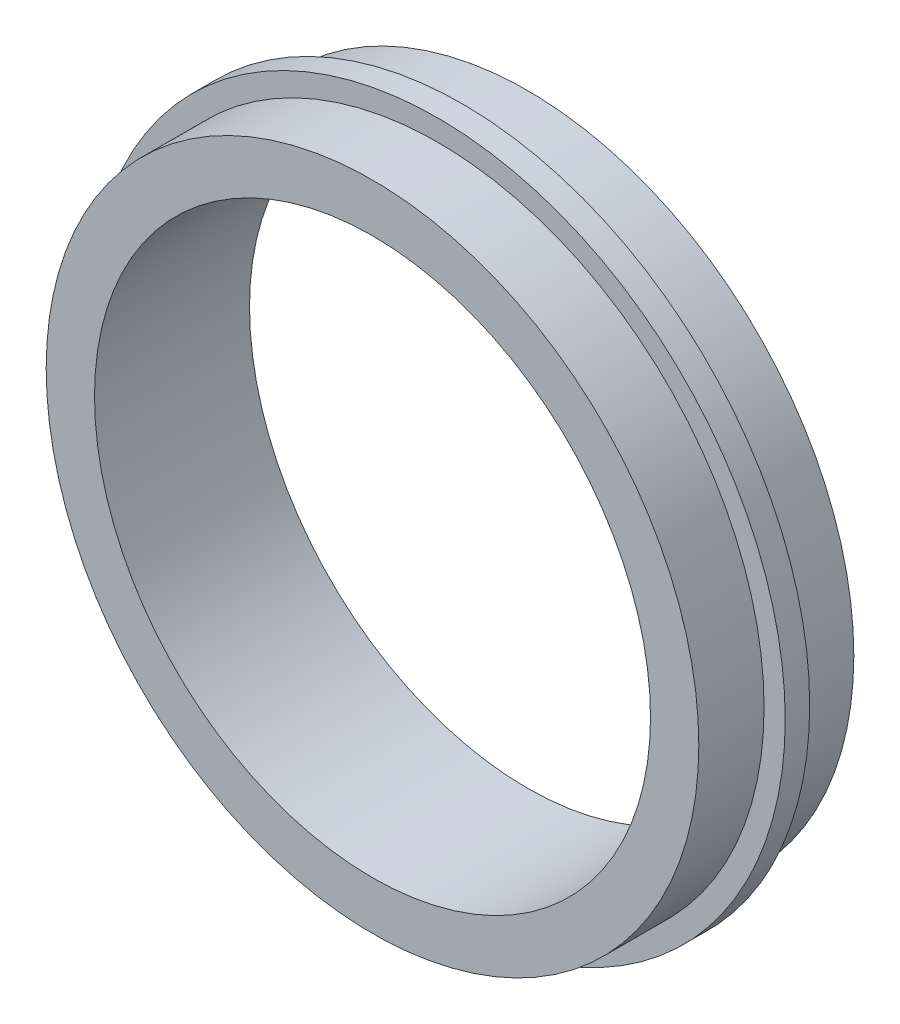
ISO-10303-21;
HEADER;
FILE_DESCRIPTION(('STEP AP214'),'2;1');
FILE_NAME('part.step','',(''),(''),'','','');
FILE_SCHEMA(('AUTOMOTIVE_DESIGN { 1 0 10303 214 1 1 1 1 }'));
ENDSEC;
DATA;
#1=APPLICATION_CONTEXT('core data for automotive mechanical design processes');
#2=APPLICATION_PROTOCOL_DEFINITION('international standard','automotive_design',2000,#1);
#3=PRODUCT_CONTEXT('',#1,'mechanical');
#4=PRODUCT('Part','Part','',(#3));
#5=PRODUCT_RELATED_PRODUCT_CATEGORY('part','',(#4));
#6=PRODUCT_DEFINITION_FORMATION('','',#4);
#7=PRODUCT_DEFINITION_CONTEXT('part definition',#1,'design');
#8=PRODUCT_DEFINITION('design','',#6,#7);
#9=PRODUCT_DEFINITION_SHAPE('','',#8);
#10=(LENGTH_UNIT() NAMED_UNIT(*) SI_UNIT(.MILLI.,.METRE.));
#11=(NAMED_UNIT(*) PLANE_ANGLE_UNIT() SI_UNIT($,.RADIAN.));
#12=(NAMED_UNIT(*) SI_UNIT($,.STERADIAN.) SOLID_ANGLE_UNIT());
#13=UNCERTAINTY_MEASURE_WITH_UNIT(LENGTH_MEASURE(1.E-05),#10,'distance_accuracy_value','');
#14=(GEOMETRIC_REPRESENTATION_CONTEXT(3) GLOBAL_UNCERTAINTY_ASSIGNED_CONTEXT((#13)) GLOBAL_UNIT_ASSIGNED_CONTEXT((#10,
#11,#12)) REPRESENTATION_CONTEXT('',''));
#15=CARTESIAN_POINT('',(0.,0.,0.));
#16=DIRECTION('',(0.,0.,1.));
#17=DIRECTION('',(1.,0.,0.));
#18=AXIS2_PLACEMENT_3D('',#15,#16,#17);
#19=CARTESIAN_POINT('',(0.,0.,0.));
#20=DIRECTION('',(0.,0.,1.));
#21=DIRECTION('',(1.,0.,0.));
#22=AXIS2_PLACEMENT_3D('',#19,#20,#21);
#23=PLANE('',#22);
#24=CARTESIAN_POINT('',(0.,0.,0.));
#25=DIRECTION('',(0.,0.,1.));
#26=DIRECTION('',(1.,0.,0.));
#27=AXIS2_PLACEMENT_3D('',#24,#25,#26);
#28=CIRCLE('',#27,63.5);
#29=CARTESIAN_POINT('',(-63.5,0.,0.));
#30=VERTEX_POINT('',#29);
#31=EDGE_CURVE('E78',#30,#30,#28,.T.);
#32=ORIENTED_EDGE('',*,*,#31,.T.);
#33=EDGE_LOOP('',(#32));
#34=FACE_BOUND('',#33,.T.);
#35=CARTESIAN_POINT('',(0.,0.,0.));
#36=DIRECTION('',(0.,0.,-1.));
#37=DIRECTION('',(-1.,0.,0.));
#38=AXIS2_PLACEMENT_3D('',#35,#36,#37);
#39=CIRCLE('',#38,67.6148060125264);
#40=CARTESIAN_POINT('',(67.6148060125264,0.,0.));
#41=VERTEX_POINT('',#40);
#42=EDGE_CURVE('E11',#41,#41,#39,.T.);
#43=ORIENTED_EDGE('',*,*,#42,.T.);
#44=EDGE_LOOP('',(#43));
#45=FACE_BOUND('',#44,.T.);
#46=ADVANCED_FACE('F16',(#34,#45),#23,.F.);
#47=CARTESIAN_POINT('',(0.,0.,4.7625));
#48=DIRECTION('',(0.,0.,1.));
#49=DIRECTION('',(1.,0.,0.));
#50=AXIS2_PLACEMENT_3D('',#47,#48,#49);
#51=PLANE('',#50);
#52=CARTESIAN_POINT('',(0.,0.,4.7625));
#53=DIRECTION('',(0.,0.,-1.));
#54=DIRECTION('',(-1.,0.,0.));
#55=AXIS2_PLACEMENT_3D('',#52,#53,#54);
#56=CIRCLE('',#55,63.5);
#57=CARTESIAN_POINT('',(63.5,0.,4.7625));
#58=VERTEX_POINT('',#57);
#59=EDGE_CURVE('E54',#58,#58,#56,.T.);
#60=ORIENTED_EDGE('',*,*,#59,.T.);
#61=EDGE_LOOP('',(#60));
#62=FACE_BOUND('',#61,.T.);
#63=CARTESIAN_POINT('',(0.,0.,4.7625));
#64=DIRECTION('',(0.,0.,1.));
#65=DIRECTION('',(-1.,0.,0.));
#66=AXIS2_PLACEMENT_3D('',#63,#64,#65);
#67=CIRCLE('',#66,67.6148060125264);
#68=CARTESIAN_POINT('',(67.6148060125264,0.,4.7625));
#69=VERTEX_POINT('',#68);
#70=EDGE_CURVE('E25',#69,#69,#67,.T.);
#71=ORIENTED_EDGE('',*,*,#70,.T.);
#72=EDGE_LOOP('',(#71));
#73=FACE_BOUND('',#72,.T.);
#74=ADVANCED_FACE('F184',(#62,#73),#51,.T.);
#75=CARTESIAN_POINT('',(0.,0.,0.));
#76=DIRECTION('',(0.,0.,1.));
#77=DIRECTION('',(-1.,0.,0.));
#78=AXIS2_PLACEMENT_3D('',#75,#76,#77);
#79=CYLINDRICAL_SURFACE('',#78,67.6148060125264);
#80=ORIENTED_EDGE('',*,*,#42,.F.);
#81=EDGE_LOOP('',(#80));
#82=FACE_BOUND('',#81,.T.);
#83=ORIENTED_EDGE('',*,*,#70,.F.);
#84=EDGE_LOOP('',(#83));
#85=FACE_BOUND('',#84,.T.);
#86=ADVANCED_FACE('F18',(#82,#85),#79,.T.);
#87=CARTESIAN_POINT('',(0.,0.,0.));
#88=DIRECTION('',(0.,0.,1.));
#89=DIRECTION('',(-1.,0.,0.));
#90=AXIS2_PLACEMENT_3D('',#87,#88,#89);
#91=CYLINDRICAL_SURFACE('',#90,54.0980387650324);
#92=CARTESIAN_POINT('',(0.,0.,17.4625));
#93=DIRECTION('',(0.,0.,-1.));
#94=DIRECTION('',(-1.,0.,0.));
#95=AXIS2_PLACEMENT_3D('',#92,#93,#94);
#96=CIRCLE('',#95,54.0980387650324);
#97=CARTESIAN_POINT('',(54.0980387650324,0.,17.4625));
#98=VERTEX_POINT('',#97);
#99=EDGE_CURVE('E94',#98,#98,#96,.T.);
#100=ORIENTED_EDGE('',*,*,#99,.F.);
#101=EDGE_LOOP('',(#100));
#102=FACE_BOUND('',#101,.T.);
#103=CARTESIAN_POINT('',(0.,0.,-12.7));
#104=DIRECTION('',(0.,0.,1.));
#105=DIRECTION('',(1.,0.,0.));
#106=AXIS2_PLACEMENT_3D('',#103,#104,#105);
#107=CIRCLE('',#106,54.0980387650324);
#108=CARTESIAN_POINT('',(-54.0980387650324,0.,-12.7));
#109=VERTEX_POINT('',#108);
#110=EDGE_CURVE('E81',#109,#109,#107,.T.);
#111=ORIENTED_EDGE('',*,*,#110,.F.);
#112=EDGE_LOOP('',(#111));
#113=FACE_BOUND('',#112,.T.);
#114=ADVANCED_FACE('F165',(#102,#113),#91,.F.);
#115=CARTESIAN_POINT('',(0.,0.,17.4625));
#116=DIRECTION('',(0.,0.,1.));
#117=DIRECTION('',(1.,0.,0.));
#118=AXIS2_PLACEMENT_3D('',#115,#116,#117);
#119=PLANE('',#118);
#120=ORIENTED_EDGE('',*,*,#99,.T.);
#121=EDGE_LOOP('',(#120));
#122=FACE_BOUND('',#121,.T.);
#123=CARTESIAN_POINT('',(0.,0.,17.4625));
#124=DIRECTION('',(0.,0.,1.));
#125=DIRECTION('',(-1.,0.,0.));
#126=AXIS2_PLACEMENT_3D('',#123,#124,#125);
#127=CIRCLE('',#126,63.5);
#128=CARTESIAN_POINT('',(63.5,0.,17.4625));
#129=VERTEX_POINT('',#128);
#130=EDGE_CURVE('E62',#129,#129,#127,.T.);
#131=ORIENTED_EDGE('',*,*,#130,.T.);
#132=EDGE_LOOP('',(#131));
#133=FACE_BOUND('',#132,.T.);
#134=ADVANCED_FACE('F154',(#122,#133),#119,.T.);
#135=CARTESIAN_POINT('',(0.,0.,4.7625));
#136=DIRECTION('',(0.,0.,1.));
#137=DIRECTION('',(-1.,0.,0.));
#138=AXIS2_PLACEMENT_3D('',#135,#136,#137);
#139=CYLINDRICAL_SURFACE('',#138,63.5);
#140=ORIENTED_EDGE('',*,*,#59,.F.);
#141=EDGE_LOOP('',(#140));
#142=FACE_BOUND('',#141,.T.);
#143=ORIENTED_EDGE('',*,*,#130,.F.);
#144=EDGE_LOOP('',(#143));
#145=FACE_BOUND('',#144,.T.);
#146=ADVANCED_FACE('F143',(#142,#145),#139,.T.);
#147=CARTESIAN_POINT('',(0.,0.,-12.7));
#148=DIRECTION('',(0.,0.,1.));
#149=DIRECTION('',(1.,0.,0.));
#150=AXIS2_PLACEMENT_3D('',#147,#148,#149);
#151=PLANE('',#150);
#152=ORIENTED_EDGE('',*,*,#110,.T.);
#153=EDGE_LOOP('',(#152));
#154=FACE_BOUND('',#153,.T.);
#155=CARTESIAN_POINT('',(0.,0.,-12.7));
#156=DIRECTION('',(0.,0.,-1.));
#157=DIRECTION('',(1.,0.,0.));
#158=AXIS2_PLACEMENT_3D('',#155,#156,#157);
#159=CIRCLE('',#158,63.5);
#160=CARTESIAN_POINT('',(-63.5,0.,-12.7));
#161=VERTEX_POINT('',#160);
#162=EDGE_CURVE('E73',#161,#161,#159,.T.);
#163=ORIENTED_EDGE('',*,*,#162,.T.);
#164=EDGE_LOOP('',(#163));
#165=FACE_BOUND('',#164,.T.);
#166=ADVANCED_FACE('F131',(#154,#165),#151,.F.);
#167=CARTESIAN_POINT('',(0.,0.,0.));
#168=DIRECTION('',(0.,0.,-1.));
#169=DIRECTION('',(1.,0.,0.));
#170=AXIS2_PLACEMENT_3D('',#167,#168,#169);
#171=CYLINDRICAL_SURFACE('',#170,63.5);
#172=ORIENTED_EDGE('',*,*,#31,.F.);
#173=EDGE_LOOP('',(#172));
#174=FACE_BOUND('',#173,.T.);
#175=ORIENTED_EDGE('',*,*,#162,.F.);
#176=EDGE_LOOP('',(#175));
#177=FACE_BOUND('',#176,.T.);
#178=ADVANCED_FACE('F125',(#174,#177),#171,.T.);
#179=CLOSED_SHELL('',(#46,#74,#86,#114,#134,#146,#166,#178));
#180=MANIFOLD_SOLID_BREP('B1',#179);
#181=ADVANCED_BREP_SHAPE_REPRESENTATION('',(#18,#180),#14);
#182=SHAPE_DEFINITION_REPRESENTATION(#9,#181);
ENDSEC;
END-ISO-10303-21;
